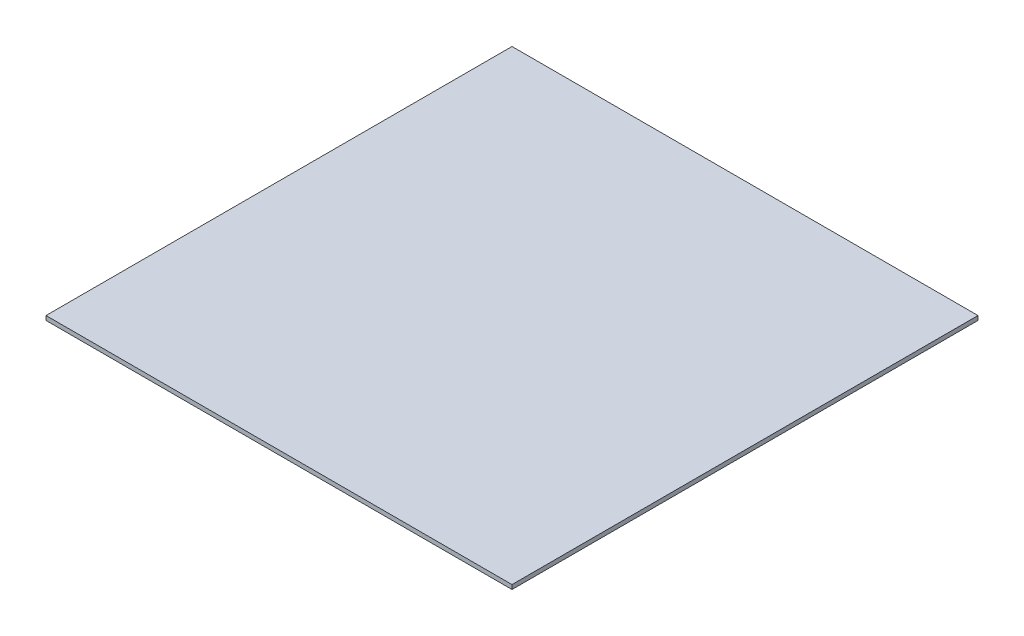
ISO-10303-21;
HEADER;
FILE_DESCRIPTION(('STEP AP214'),'2;1');
FILE_NAME('part.step','',(''),(''),'','','');
FILE_SCHEMA(('AUTOMOTIVE_DESIGN { 1 0 10303 214 1 1 1 1 }'));
ENDSEC;
DATA;
#1=APPLICATION_CONTEXT('core data for automotive mechanical design processes');
#2=APPLICATION_PROTOCOL_DEFINITION('international standard','automotive_design',2000,#1);
#3=PRODUCT_CONTEXT('',#1,'mechanical');
#4=PRODUCT('Part','Part','',(#3));
#5=PRODUCT_RELATED_PRODUCT_CATEGORY('part','',(#4));
#6=PRODUCT_DEFINITION_FORMATION('','',#4);
#7=PRODUCT_DEFINITION_CONTEXT('part definition',#1,'design');
#8=PRODUCT_DEFINITION('design','',#6,#7);
#9=PRODUCT_DEFINITION_SHAPE('','',#8);
#10=(LENGTH_UNIT() NAMED_UNIT(*) SI_UNIT(.MILLI.,.METRE.));
#11=(NAMED_UNIT(*) PLANE_ANGLE_UNIT() SI_UNIT($,.RADIAN.));
#12=(NAMED_UNIT(*) SI_UNIT($,.STERADIAN.) SOLID_ANGLE_UNIT());
#13=UNCERTAINTY_MEASURE_WITH_UNIT(LENGTH_MEASURE(1.E-05),#10,'distance_accuracy_value','');
#14=(GEOMETRIC_REPRESENTATION_CONTEXT(3) GLOBAL_UNCERTAINTY_ASSIGNED_CONTEXT((#13)) GLOBAL_UNIT_ASSIGNED_CONTEXT((#10,
#11,#12)) REPRESENTATION_CONTEXT('',''));
#15=CARTESIAN_POINT('',(0.,0.,0.));
#16=DIRECTION('',(0.,0.,1.));
#17=DIRECTION('',(1.,0.,0.));
#18=AXIS2_PLACEMENT_3D('',#15,#16,#17);
#19=CARTESIAN_POINT('',(163.,3.,-163.));
#20=DIRECTION('',(-1.,0.,0.));
#21=DIRECTION('',(0.,0.,1.));
#22=AXIS2_PLACEMENT_3D('',#19,#20,#21);
#23=PLANE('',#22);
#24=DIRECTION('',(0.,0.,-1.));
#25=VECTOR('',#24,1.);
#26=CARTESIAN_POINT('',(163.,0.,-163.));
#27=LINE('',#26,#25);
#28=CARTESIAN_POINT('',(163.,0.,163.));
#29=VERTEX_POINT('',#28);
#30=CARTESIAN_POINT('',(163.,0.,-163.));
#31=VERTEX_POINT('',#30);
#32=EDGE_CURVE('E115',#29,#31,#27,.T.);
#33=ORIENTED_EDGE('',*,*,#32,.T.);
#34=DIRECTION('',(0.,-1.,0.));
#35=VECTOR('',#34,1.);
#36=CARTESIAN_POINT('',(163.,3.,-163.));
#37=LINE('',#36,#35);
#38=CARTESIAN_POINT('',(163.,3.,-163.));
#39=VERTEX_POINT('',#38);
#40=EDGE_CURVE('E11',#39,#31,#37,.T.);
#41=ORIENTED_EDGE('',*,*,#40,.F.);
#42=DIRECTION('',(0.,0.,-1.));
#43=VECTOR('',#42,1.);
#44=CARTESIAN_POINT('',(163.,3.,-163.));
#45=LINE('',#44,#43);
#46=CARTESIAN_POINT('',(163.,3.,163.));
#47=VERTEX_POINT('',#46);
#48=EDGE_CURVE('E99',#47,#39,#45,.T.);
#49=ORIENTED_EDGE('',*,*,#48,.F.);
#50=DIRECTION('',(0.,-1.,0.));
#51=VECTOR('',#50,1.);
#52=CARTESIAN_POINT('',(163.,3.,163.));
#53=LINE('',#52,#51);
#54=EDGE_CURVE('E111',#47,#29,#53,.T.);
#55=ORIENTED_EDGE('',*,*,#54,.T.);
#56=EDGE_LOOP('',(#33,#41,#49,#55));
#57=FACE_BOUND('',#56,.T.);
#58=ADVANCED_FACE('F47',(#57),#23,.F.);
#59=CARTESIAN_POINT('',(-163.,3.,-163.));
#60=DIRECTION('',(0.,0.,1.));
#61=DIRECTION('',(1.,0.,0.));
#62=AXIS2_PLACEMENT_3D('',#59,#60,#61);
#63=PLANE('',#62);
#64=DIRECTION('',(-1.,0.,0.));
#65=VECTOR('',#64,1.);
#66=CARTESIAN_POINT('',(-163.,0.,-163.));
#67=LINE('',#66,#65);
#68=CARTESIAN_POINT('',(-163.,0.,-163.));
#69=VERTEX_POINT('',#68);
#70=EDGE_CURVE('E104',#31,#69,#67,.T.);
#71=ORIENTED_EDGE('',*,*,#70,.T.);
#72=DIRECTION('',(0.,-1.,0.));
#73=VECTOR('',#72,1.);
#74=CARTESIAN_POINT('',(-163.,3.,-163.));
#75=LINE('',#74,#73);
#76=CARTESIAN_POINT('',(-163.,3.,-163.));
#77=VERTEX_POINT('',#76);
#78=EDGE_CURVE('E56',#77,#69,#75,.T.);
#79=ORIENTED_EDGE('',*,*,#78,.F.);
#80=DIRECTION('',(-1.,0.,0.));
#81=VECTOR('',#80,1.);
#82=CARTESIAN_POINT('',(-163.,3.,-163.));
#83=LINE('',#82,#81);
#84=EDGE_CURVE('E94',#39,#77,#83,.T.);
#85=ORIENTED_EDGE('',*,*,#84,.F.);
#86=ORIENTED_EDGE('',*,*,#40,.T.);
#87=EDGE_LOOP('',(#71,#79,#85,#86));
#88=FACE_BOUND('',#87,.T.);
#89=ADVANCED_FACE('F103',(#88),#63,.F.);
#90=CARTESIAN_POINT('',(-163.,3.,-163.));
#91=DIRECTION('',(1.,0.,0.));
#92=DIRECTION('',(0.,0.,-1.));
#93=AXIS2_PLACEMENT_3D('',#90,#91,#92);
#94=PLANE('',#93);
#95=DIRECTION('',(0.,0.,1.));
#96=VECTOR('',#95,1.);
#97=CARTESIAN_POINT('',(-163.,0.,-163.));
#98=LINE('',#97,#96);
#99=CARTESIAN_POINT('',(-163.,0.,163.));
#100=VERTEX_POINT('',#99);
#101=EDGE_CURVE('E81',#69,#100,#98,.T.);
#102=ORIENTED_EDGE('',*,*,#101,.T.);
#103=DIRECTION('',(0.,-1.,0.));
#104=VECTOR('',#103,1.);
#105=CARTESIAN_POINT('',(-163.,3.,163.));
#106=LINE('',#105,#104);
#107=CARTESIAN_POINT('',(-163.,3.,163.));
#108=VERTEX_POINT('',#107);
#109=EDGE_CURVE('E106',#108,#100,#106,.T.);
#110=ORIENTED_EDGE('',*,*,#109,.F.);
#111=DIRECTION('',(0.,0.,1.));
#112=VECTOR('',#111,1.);
#113=CARTESIAN_POINT('',(-163.,3.,-163.));
#114=LINE('',#113,#112);
#115=EDGE_CURVE('E97',#77,#108,#114,.T.);
#116=ORIENTED_EDGE('',*,*,#115,.F.);
#117=ORIENTED_EDGE('',*,*,#78,.T.);
#118=EDGE_LOOP('',(#102,#110,#116,#117));
#119=FACE_BOUND('',#118,.T.);
#120=ADVANCED_FACE('F107',(#119),#94,.F.);
#121=CARTESIAN_POINT('',(-163.,3.,163.));
#122=DIRECTION('',(0.,0.,-1.));
#123=DIRECTION('',(-1.,0.,0.));
#124=AXIS2_PLACEMENT_3D('',#121,#122,#123);
#125=PLANE('',#124);
#126=DIRECTION('',(1.,0.,0.));
#127=VECTOR('',#126,1.);
#128=CARTESIAN_POINT('',(-163.,0.,163.));
#129=LINE('',#128,#127);
#130=EDGE_CURVE('E87',#100,#29,#129,.T.);
#131=ORIENTED_EDGE('',*,*,#130,.T.);
#132=ORIENTED_EDGE('',*,*,#54,.F.);
#133=DIRECTION('',(1.,0.,0.));
#134=VECTOR('',#133,1.);
#135=CARTESIAN_POINT('',(-163.,3.,163.));
#136=LINE('',#135,#134);
#137=EDGE_CURVE('E64',#108,#47,#136,.T.);
#138=ORIENTED_EDGE('',*,*,#137,.F.);
#139=ORIENTED_EDGE('',*,*,#109,.T.);
#140=EDGE_LOOP('',(#131,#132,#138,#139));
#141=FACE_BOUND('',#140,.T.);
#142=ADVANCED_FACE('F128',(#141),#125,.F.);
#143=CARTESIAN_POINT('',(0.,3.,0.));
#144=DIRECTION('',(0.,1.,0.));
#145=DIRECTION('',(0.,0.,1.));
#146=AXIS2_PLACEMENT_3D('',#143,#144,#145);
#147=PLANE('',#146);
#148=ORIENTED_EDGE('',*,*,#48,.T.);
#149=ORIENTED_EDGE('',*,*,#84,.T.);
#150=ORIENTED_EDGE('',*,*,#115,.T.);
#151=ORIENTED_EDGE('',*,*,#137,.T.);
#152=EDGE_LOOP('',(#148,#149,#150,#151));
#153=FACE_BOUND('',#152,.T.);
#154=ADVANCED_FACE('F95',(#153),#147,.T.);
#155=CARTESIAN_POINT('',(0.,0.,0.));
#156=DIRECTION('',(0.,1.,0.));
#157=DIRECTION('',(0.,0.,1.));
#158=AXIS2_PLACEMENT_3D('',#155,#156,#157);
#159=PLANE('',#158);
#160=ORIENTED_EDGE('',*,*,#32,.F.);
#161=ORIENTED_EDGE('',*,*,#130,.F.);
#162=ORIENTED_EDGE('',*,*,#101,.F.);
#163=ORIENTED_EDGE('',*,*,#70,.F.);
#164=EDGE_LOOP('',(#160,#161,#162,#163));
#165=FACE_BOUND('',#164,.T.);
#166=ADVANCED_FACE('F131',(#165),#159,.F.);
#167=CLOSED_SHELL('',(#58,#89,#120,#142,#154,#166));
#168=MANIFOLD_SOLID_BREP('B2',#167);
#169=ADVANCED_BREP_SHAPE_REPRESENTATION('',(#18,#168),#14);
#170=SHAPE_DEFINITION_REPRESENTATION(#9,#169);
ENDSEC;
END-ISO-10303-21;
